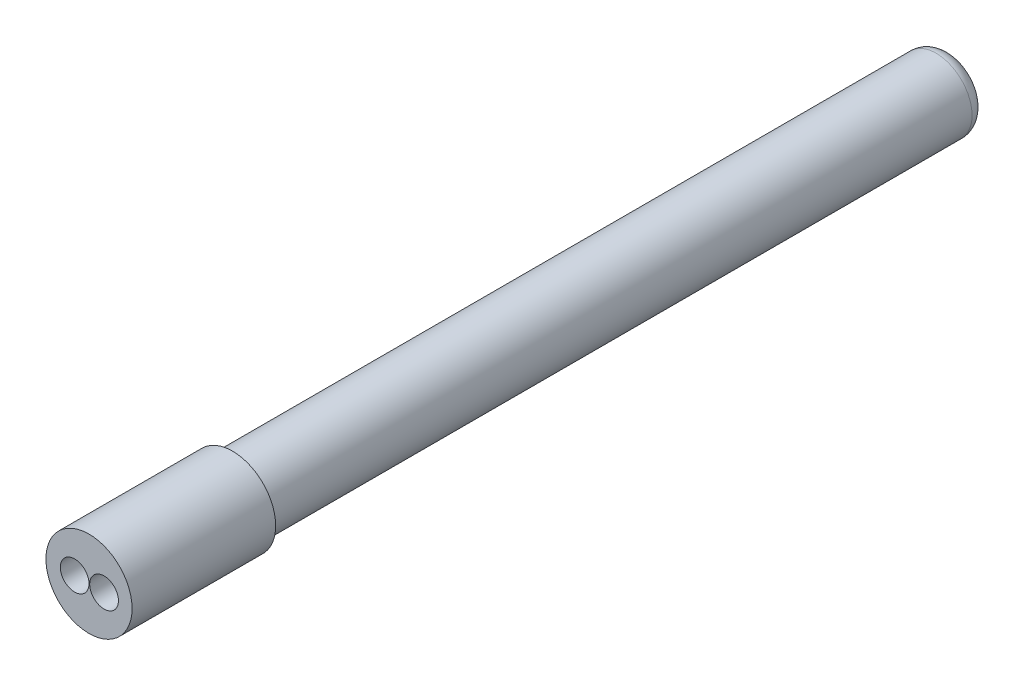
ISO-10303-21;
HEADER;
FILE_DESCRIPTION(('STEP AP214'),'2;1');
FILE_NAME('part.step','',(''),(''),'','','');
FILE_SCHEMA(('AUTOMOTIVE_DESIGN { 1 0 10303 214 1 1 1 1 }'));
ENDSEC;
DATA;
#1=APPLICATION_CONTEXT('core data for automotive mechanical design processes');
#2=APPLICATION_PROTOCOL_DEFINITION('international standard','automotive_design',2000,#1);
#3=PRODUCT_CONTEXT('',#1,'mechanical');
#4=PRODUCT('Part','Part','',(#3));
#5=PRODUCT_RELATED_PRODUCT_CATEGORY('part','',(#4));
#6=PRODUCT_DEFINITION_FORMATION('','',#4);
#7=PRODUCT_DEFINITION_CONTEXT('part definition',#1,'design');
#8=PRODUCT_DEFINITION('design','',#6,#7);
#9=PRODUCT_DEFINITION_SHAPE('','',#8);
#10=(LENGTH_UNIT() NAMED_UNIT(*) SI_UNIT(.MILLI.,.METRE.));
#11=(NAMED_UNIT(*) PLANE_ANGLE_UNIT() SI_UNIT($,.RADIAN.));
#12=(NAMED_UNIT(*) SI_UNIT($,.STERADIAN.) SOLID_ANGLE_UNIT());
#13=UNCERTAINTY_MEASURE_WITH_UNIT(LENGTH_MEASURE(1.E-05),#10,'distance_accuracy_value','');
#14=(GEOMETRIC_REPRESENTATION_CONTEXT(3) GLOBAL_UNCERTAINTY_ASSIGNED_CONTEXT((#13)) GLOBAL_UNIT_ASSIGNED_CONTEXT((#10,
#11,#12)) REPRESENTATION_CONTEXT('',''));
#15=CARTESIAN_POINT('',(0.,0.,0.));
#16=DIRECTION('',(0.,0.,1.));
#17=DIRECTION('',(1.,0.,0.));
#18=AXIS2_PLACEMENT_3D('',#15,#16,#17);
#19=CARTESIAN_POINT('',(0.,0.,100.));
#20=DIRECTION('',(0.,0.,-1.));
#21=DIRECTION('',(-1.,0.,0.));
#22=AXIS2_PLACEMENT_3D('',#19,#20,#21);
#23=CYLINDRICAL_SURFACE('',#22,5.);
#24=CARTESIAN_POINT('',(0.,0.,2.));
#25=DIRECTION('',(0.,0.,1.));
#26=DIRECTION('',(1.,0.,0.));
#27=AXIS2_PLACEMENT_3D('',#24,#25,#26);
#28=CIRCLE('',#27,5.);
#29=CARTESIAN_POINT('',(5.,0.,2.));
#30=VERTEX_POINT('',#29);
#31=EDGE_CURVE('E57',#30,#30,#28,.T.);
#32=ORIENTED_EDGE('',*,*,#31,.T.);
#33=EDGE_LOOP('',(#32));
#34=FACE_BOUND('',#33,.T.);
#35=CARTESIAN_POINT('',(0.,0.,100.));
#36=DIRECTION('',(0.,0.,1.));
#37=DIRECTION('',(1.,0.,0.));
#38=AXIS2_PLACEMENT_3D('',#35,#36,#37);
#39=CIRCLE('',#38,5.);
#40=CARTESIAN_POINT('',(5.,0.,100.));
#41=VERTEX_POINT('',#40);
#42=EDGE_CURVE('E62',#41,#41,#39,.T.);
#43=ORIENTED_EDGE('',*,*,#42,.F.);
#44=EDGE_LOOP('',(#43));
#45=FACE_BOUND('',#44,.T.);
#46=ADVANCED_FACE('F49',(#34,#45),#23,.T.);
#47=CARTESIAN_POINT('',(0.,0.,0.));
#48=DIRECTION('',(0.,0.,1.));
#49=DIRECTION('',(1.,0.,0.));
#50=AXIS2_PLACEMENT_3D('',#47,#48,#49);
#51=PLANE('',#50);
#52=CARTESIAN_POINT('',(0.,0.,0.));
#53=DIRECTION('',(0.,0.,1.));
#54=DIRECTION('',(1.,0.,0.));
#55=AXIS2_PLACEMENT_3D('',#52,#53,#54);
#56=CIRCLE('',#55,3.);
#57=CARTESIAN_POINT('',(3.,0.,0.));
#58=VERTEX_POINT('',#57);
#59=EDGE_CURVE('E10',#58,#58,#56,.F.);
#60=ORIENTED_EDGE('',*,*,#59,.T.);
#61=EDGE_LOOP('',(#60));
#62=FACE_BOUND('',#61,.T.);
#63=ADVANCED_FACE('F129',(#62),#51,.F.);
#64=CARTESIAN_POINT('',(0.,0.,2.));
#65=DIRECTION('',(0.,0.,1.));
#66=DIRECTION('',(1.,0.,0.));
#67=AXIS2_PLACEMENT_3D('',#64,#65,#66);
#68=TOROIDAL_SURFACE('',#67,3.,2.);
#69=ORIENTED_EDGE('',*,*,#59,.F.);
#70=EDGE_LOOP('',(#69));
#71=FACE_BOUND('',#70,.T.);
#72=ORIENTED_EDGE('',*,*,#31,.F.);
#73=EDGE_LOOP('',(#72));
#74=FACE_BOUND('',#73,.T.);
#75=ADVANCED_FACE('F51',(#71,#74),#68,.T.);
#76=CARTESIAN_POINT('',(0.,0.,120.));
#77=DIRECTION('',(0.,0.,-1.));
#78=DIRECTION('',(-1.,0.,0.));
#79=AXIS2_PLACEMENT_3D('',#76,#77,#78);
#80=CYLINDRICAL_SURFACE('',#79,6.);
#81=CARTESIAN_POINT('',(0.,0.,120.));
#82=DIRECTION('',(0.,0.,1.));
#83=DIRECTION('',(1.,0.,0.));
#84=AXIS2_PLACEMENT_3D('',#81,#82,#83);
#85=CIRCLE('',#84,6.);
#86=CARTESIAN_POINT('',(6.,0.,120.));
#87=VERTEX_POINT('',#86);
#88=EDGE_CURVE('E67',#87,#87,#85,.T.);
#89=ORIENTED_EDGE('',*,*,#88,.F.);
#90=EDGE_LOOP('',(#89));
#91=FACE_BOUND('',#90,.T.);
#92=CARTESIAN_POINT('',(0.,0.,100.));
#93=DIRECTION('',(0.,0.,1.));
#94=DIRECTION('',(1.,0.,0.));
#95=AXIS2_PLACEMENT_3D('',#92,#93,#94);
#96=CIRCLE('',#95,6.);
#97=CARTESIAN_POINT('',(6.,0.,100.));
#98=VERTEX_POINT('',#97);
#99=EDGE_CURVE('E70',#98,#98,#96,.T.);
#100=ORIENTED_EDGE('',*,*,#99,.T.);
#101=EDGE_LOOP('',(#100));
#102=FACE_BOUND('',#101,.T.);
#103=ADVANCED_FACE('F107',(#91,#102),#80,.T.);
#104=CARTESIAN_POINT('',(0.,0.,120.));
#105=DIRECTION('',(0.,0.,1.));
#106=DIRECTION('',(1.,0.,0.));
#107=AXIS2_PLACEMENT_3D('',#104,#105,#106);
#108=PLANE('',#107);
#109=CARTESIAN_POINT('',(-2.,0.,120.));
#110=DIRECTION('',(0.,0.,1.));
#111=DIRECTION('',(1.,0.,0.));
#112=AXIS2_PLACEMENT_3D('',#109,#110,#111);
#113=CIRCLE('',#112,2.);
#114=CARTESIAN_POINT('',(0.,0.,120.));
#115=VERTEX_POINT('',#114);
#116=EDGE_CURVE('E86',#115,#115,#113,.T.);
#117=ORIENTED_EDGE('',*,*,#116,.F.);
#118=EDGE_LOOP('',(#117));
#119=FACE_BOUND('',#118,.T.);
#120=CARTESIAN_POINT('',(2.1,0.,120.));
#121=DIRECTION('',(0.,0.,1.));
#122=DIRECTION('',(1.,0.,0.));
#123=AXIS2_PLACEMENT_3D('',#120,#121,#122);
#124=CIRCLE('',#123,2.);
#125=CARTESIAN_POINT('',(4.1,0.,120.));
#126=VERTEX_POINT('',#125);
#127=EDGE_CURVE('E82',#126,#126,#124,.T.);
#128=ORIENTED_EDGE('',*,*,#127,.F.);
#129=EDGE_LOOP('',(#128));
#130=FACE_BOUND('',#129,.T.);
#131=ORIENTED_EDGE('',*,*,#88,.T.);
#132=EDGE_LOOP('',(#131));
#133=FACE_BOUND('',#132,.T.);
#134=ADVANCED_FACE('F103',(#119,#130,#133),#108,.T.);
#135=CARTESIAN_POINT('',(0.,0.,100.));
#136=DIRECTION('',(0.,0.,1.));
#137=DIRECTION('',(1.,0.,0.));
#138=AXIS2_PLACEMENT_3D('',#135,#136,#137);
#139=PLANE('',#138);
#140=ORIENTED_EDGE('',*,*,#42,.T.);
#141=EDGE_LOOP('',(#140));
#142=FACE_BOUND('',#141,.T.);
#143=ORIENTED_EDGE('',*,*,#99,.F.);
#144=EDGE_LOOP('',(#143));
#145=FACE_BOUND('',#144,.T.);
#146=ADVANCED_FACE('F106',(#142,#145),#139,.F.);
#147=CARTESIAN_POINT('',(2.1,0.,100.));
#148=DIRECTION('',(0.,0.,1.));
#149=DIRECTION('',(1.,0.,0.));
#150=AXIS2_PLACEMENT_3D('',#147,#148,#149);
#151=CYLINDRICAL_SURFACE('',#150,2.);
#152=CARTESIAN_POINT('',(2.1,0.,100.));
#153=DIRECTION('',(0.,0.,1.));
#154=DIRECTION('',(1.,0.,0.));
#155=AXIS2_PLACEMENT_3D('',#152,#153,#154);
#156=CIRCLE('',#155,2.);
#157=CARTESIAN_POINT('',(4.1,0.,100.));
#158=VERTEX_POINT('',#157);
#159=EDGE_CURVE('E78',#158,#158,#156,.T.);
#160=ORIENTED_EDGE('',*,*,#159,.F.);
#161=EDGE_LOOP('',(#160));
#162=FACE_BOUND('',#161,.T.);
#163=ORIENTED_EDGE('',*,*,#127,.T.);
#164=EDGE_LOOP('',(#163));
#165=FACE_BOUND('',#164,.T.);
#166=ADVANCED_FACE('F119',(#162,#165),#151,.F.);
#167=CARTESIAN_POINT('',(2.1,0.,100.));
#168=DIRECTION('',(0.,0.,1.));
#169=DIRECTION('',(1.,0.,0.));
#170=AXIS2_PLACEMENT_3D('',#167,#168,#169);
#171=PLANE('',#170);
#172=ORIENTED_EDGE('',*,*,#159,.T.);
#173=EDGE_LOOP('',(#172));
#174=FACE_BOUND('',#173,.T.);
#175=ADVANCED_FACE('F99',(#174),#171,.T.);
#176=CARTESIAN_POINT('',(-2.,0.,100.));
#177=DIRECTION('',(0.,0.,1.));
#178=DIRECTION('',(1.,0.,0.));
#179=AXIS2_PLACEMENT_3D('',#176,#177,#178);
#180=CYLINDRICAL_SURFACE('',#179,2.);
#181=CARTESIAN_POINT('',(-2.,0.,100.));
#182=DIRECTION('',(0.,0.,1.));
#183=DIRECTION('',(1.,0.,0.));
#184=AXIS2_PLACEMENT_3D('',#181,#182,#183);
#185=CIRCLE('',#184,2.);
#186=CARTESIAN_POINT('',(0.,0.,100.));
#187=VERTEX_POINT('',#186);
#188=EDGE_CURVE('E74',#187,#187,#185,.T.);
#189=ORIENTED_EDGE('',*,*,#188,.F.);
#190=EDGE_LOOP('',(#189));
#191=FACE_BOUND('',#190,.T.);
#192=ORIENTED_EDGE('',*,*,#116,.T.);
#193=EDGE_LOOP('',(#192));
#194=FACE_BOUND('',#193,.T.);
#195=ADVANCED_FACE('F96',(#191,#194),#180,.F.);
#196=CARTESIAN_POINT('',(-2.,0.,100.));
#197=DIRECTION('',(0.,0.,1.));
#198=DIRECTION('',(1.,0.,0.));
#199=AXIS2_PLACEMENT_3D('',#196,#197,#198);
#200=PLANE('',#199);
#201=ORIENTED_EDGE('',*,*,#188,.T.);
#202=EDGE_LOOP('',(#201));
#203=FACE_BOUND('',#202,.T.);
#204=ADVANCED_FACE('F94',(#203),#200,.T.);
#205=CLOSED_SHELL('',(#46,#63,#75,#103,#134,#146,#166,#175,#195,#204));
#206=MANIFOLD_SOLID_BREP('B2',#205);
#207=ADVANCED_BREP_SHAPE_REPRESENTATION('',(#18,#206),#14);
#208=SHAPE_DEFINITION_REPRESENTATION(#9,#207);
ENDSEC;
END-ISO-10303-21;
